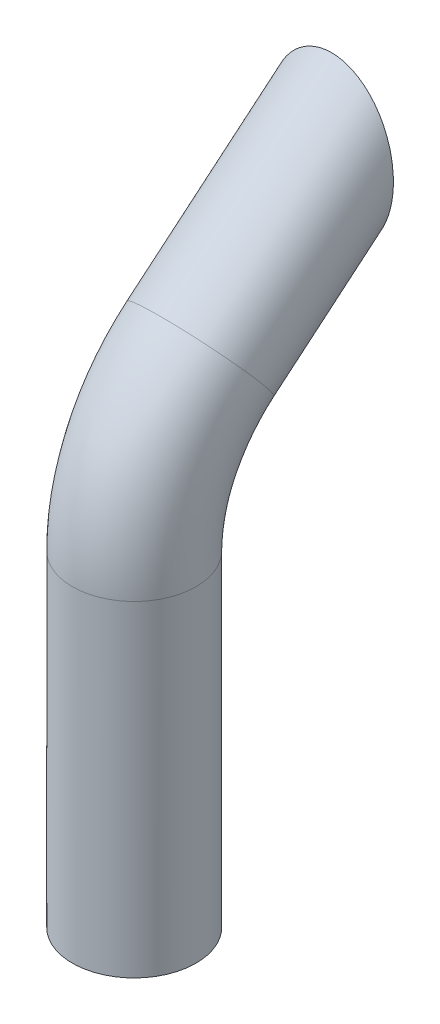
ISO-10303-21;
HEADER;
FILE_DESCRIPTION(('STEP AP214'),'2;1');
FILE_NAME('part.step','',(''),(''),'','','');
FILE_SCHEMA(('AUTOMOTIVE_DESIGN { 1 0 10303 214 1 1 1 1 }'));
ENDSEC;
DATA;
#1=APPLICATION_CONTEXT('core data for automotive mechanical design processes');
#2=APPLICATION_PROTOCOL_DEFINITION('international standard','automotive_design',2000,#1);
#3=PRODUCT_CONTEXT('',#1,'mechanical');
#4=PRODUCT('Part','Part','',(#3));
#5=PRODUCT_RELATED_PRODUCT_CATEGORY('part','',(#4));
#6=PRODUCT_DEFINITION_FORMATION('','',#4);
#7=PRODUCT_DEFINITION_CONTEXT('part definition',#1,'design');
#8=PRODUCT_DEFINITION('design','',#6,#7);
#9=PRODUCT_DEFINITION_SHAPE('','',#8);
#10=(LENGTH_UNIT() NAMED_UNIT(*) SI_UNIT(.MILLI.,.METRE.));
#11=(NAMED_UNIT(*) PLANE_ANGLE_UNIT() SI_UNIT($,.RADIAN.));
#12=(NAMED_UNIT(*) SI_UNIT($,.STERADIAN.) SOLID_ANGLE_UNIT());
#13=UNCERTAINTY_MEASURE_WITH_UNIT(LENGTH_MEASURE(1.E-05),#10,'distance_accuracy_value','');
#14=(GEOMETRIC_REPRESENTATION_CONTEXT(3) GLOBAL_UNCERTAINTY_ASSIGNED_CONTEXT((#13)) GLOBAL_UNIT_ASSIGNED_CONTEXT((#10,
#11,#12)) REPRESENTATION_CONTEXT('',''));
#15=CARTESIAN_POINT('',(0.,0.,0.));
#16=DIRECTION('',(0.,0.,1.));
#17=DIRECTION('',(1.,0.,0.));
#18=AXIS2_PLACEMENT_3D('',#15,#16,#17);
#19=CARTESIAN_POINT('',(0.,-296.418141452981,114.906666467847));
#20=DIRECTION('',(0.,-1.,0.));
#21=DIRECTION('',(0.,0.,-1.));
#22=AXIS2_PLACEMENT_3D('',#19,#20,#21);
#23=PLANE('',#22);
#24=CARTESIAN_POINT('',(0.,-296.418141452981,114.906666467847));
#25=DIRECTION('',(0.,-1.,0.));
#26=DIRECTION('',(0.,0.,-1.));
#27=AXIS2_PLACEMENT_3D('',#24,#25,#26);
#28=CIRCLE('',#27,27.);
#29=CARTESIAN_POINT('',(0.,-296.418141452981,87.9066664678468));
#30=VERTEX_POINT('',#29);
#31=EDGE_CURVE('E47',#30,#30,#28,.T.);
#32=ORIENTED_EDGE('',*,*,#31,.F.);
#33=EDGE_LOOP('',(#32));
#34=FACE_BOUND('',#33,.T.);
#35=CARTESIAN_POINT('',(0.,-296.418141452981,114.906666467847));
#36=DIRECTION('',(0.,-1.,0.));
#37=DIRECTION('',(0.,0.,-1.));
#38=AXIS2_PLACEMENT_3D('',#35,#36,#37);
#39=CIRCLE('',#38,30.);
#40=CARTESIAN_POINT('',(0.,-296.418141452981,84.9066664678468));
#41=VERTEX_POINT('',#40);
#42=EDGE_CURVE('E10',#41,#41,#39,.T.);
#43=ORIENTED_EDGE('',*,*,#42,.T.);
#44=EDGE_LOOP('',(#43));
#45=FACE_BOUND('',#44,.T.);
#46=ADVANCED_FACE('F31',(#34,#45),#23,.T.);
#47=CARTESIAN_POINT('',(0.,0.,0.));
#48=DIRECTION('',(0.,-0.642787609686538,0.766044443118979));
#49=DIRECTION('',(0.,-0.766044443118979,-0.642787609686538));
#50=AXIS2_PLACEMENT_3D('',#47,#48,#49);
#51=CYLINDRICAL_SURFACE('',#50,30.);
#52=CARTESIAN_POINT('',(0.,-16.1808853863989,19.2836282905961));
#53=DIRECTION('',(0.,0.,1.));
#54=DIRECTION('',(0.,-1.,0.));
#55=AXIS2_PLACEMENT_3D('',#52,#53,#54);
#56=ELLIPSE('',#55,39.1622186799683,30.);
#57=CARTESIAN_POINT('',(0.,-55.3431040663672,19.2836282905961));
#58=VERTEX_POINT('',#57);
#59=EDGE_CURVE('E56',#58,#58,#56,.F.);
#60=ORIENTED_EDGE('',*,*,#59,.F.);
#61=EDGE_LOOP('',(#60));
#62=FACE_BOUND('',#61,.T.);
#63=CARTESIAN_POINT('',(0.,-69.4418308062222,82.757551339635));
#64=DIRECTION('',(0.,-0.642787609686538,0.766044443118979));
#65=DIRECTION('',(0.,-0.766044443118979,-0.642787609686538));
#66=AXIS2_PLACEMENT_3D('',#63,#64,#65);
#67=CIRCLE('',#66,30.);
#68=CARTESIAN_POINT('',(0.,-46.4604975126528,102.041179630231));
#69=VERTEX_POINT('',#68);
#70=EDGE_CURVE('E42',#69,#69,#67,.T.);
#71=ORIENTED_EDGE('',*,*,#70,.F.);
#72=EDGE_LOOP('',(#71));
#73=FACE_BOUND('',#72,.T.);
#74=ADVANCED_FACE('F85',(#62,#73),#51,.T.);
#75=CARTESIAN_POINT('',(0.,-138.385830686931,24.9066664678469));
#76=DIRECTION('',(1.,0.,0.));
#77=DIRECTION('',(0.,0.,-1.));
#78=AXIS2_PLACEMENT_3D('',#75,#76,#77);
#79=TOROIDAL_SURFACE('',#78,90.,30.);
#80=CARTESIAN_POINT('',(0.,-138.385830686931,114.906666467847));
#81=DIRECTION('',(0.,-1.,0.));
#82=DIRECTION('',(0.,0.,-1.));
#83=AXIS2_PLACEMENT_3D('',#80,#81,#82);
#84=CIRCLE('',#83,30.);
#85=CARTESIAN_POINT('',(0.,-138.385830686931,144.906666467847));
#86=VERTEX_POINT('',#85);
#87=EDGE_CURVE('E38',#86,#86,#84,.T.);
#88=CARTESIAN_POINT('',(0.,-138.385830686931,24.9066664678469));
#89=DIRECTION('',(1.,0.,0.));
#90=DIRECTION('',(0.,0.,-1.));
#91=AXIS2_PLACEMENT_3D('',#88,#89,#90);
#92=CIRCLE('',#91,120.);
#93=EDGE_CURVE('',#69,#86,#92,.T.);
#94=ORIENTED_EDGE('',*,*,#70,.T.);
#95=ORIENTED_EDGE('',*,*,#87,.F.);
#96=ORIENTED_EDGE('',*,*,#93,.T.);
#97=ORIENTED_EDGE('',*,*,#93,.F.);
#98=EDGE_LOOP('',(#94,#96,#95,#97));
#99=FACE_BOUND('',#98,.T.);
#100=ADVANCED_FACE('F80',(#99),#79,.T.);
#101=CARTESIAN_POINT('',(0.,-138.385830686931,114.906666467847));
#102=DIRECTION('',(0.,-1.,0.));
#103=DIRECTION('',(0.,0.,-1.));
#104=AXIS2_PLACEMENT_3D('',#101,#102,#103);
#105=CYLINDRICAL_SURFACE('',#104,30.);
#106=ORIENTED_EDGE('',*,*,#42,.F.);
#107=EDGE_LOOP('',(#106));
#108=FACE_BOUND('',#107,.T.);
#109=ORIENTED_EDGE('',*,*,#87,.T.);
#110=EDGE_LOOP('',(#109));
#111=FACE_BOUND('',#110,.T.);
#112=ADVANCED_FACE('F78',(#108,#111),#105,.T.);
#113=CARTESIAN_POINT('',(0.,0.,0.));
#114=DIRECTION('',(0.,-0.642787609686538,0.766044443118979));
#115=DIRECTION('',(0.,-0.766044443118979,-0.642787609686538));
#116=AXIS2_PLACEMENT_3D('',#113,#114,#115);
#117=CYLINDRICAL_SURFACE('',#116,27.);
#118=CARTESIAN_POINT('',(0.,-16.1808853863989,19.2836282905961));
#119=DIRECTION('',(0.,0.,1.));
#120=DIRECTION('',(0.,-1.,0.));
#121=AXIS2_PLACEMENT_3D('',#118,#119,#120);
#122=ELLIPSE('',#121,35.2459968119715,27.);
#123=CARTESIAN_POINT('',(0.,-51.4268821983704,19.2836282905961));
#124=VERTEX_POINT('',#123);
#125=EDGE_CURVE('E34',#124,#124,#122,.F.);
#126=ORIENTED_EDGE('',*,*,#125,.T.);
#127=EDGE_LOOP('',(#126));
#128=FACE_BOUND('',#127,.T.);
#129=CARTESIAN_POINT('',(0.,-69.4418308062223,82.757551339635));
#130=DIRECTION('',(0.,0.642787609686535,-0.766044443118981));
#131=DIRECTION('',(0.,0.766044443118981,0.642787609686535));
#132=AXIS2_PLACEMENT_3D('',#129,#130,#131);
#133=CIRCLE('',#132,27.);
#134=CARTESIAN_POINT('',(0.,-48.7586308420098,100.112816801171));
#135=VERTEX_POINT('',#134);
#136=EDGE_CURVE('E53',#135,#135,#133,.F.);
#137=ORIENTED_EDGE('',*,*,#136,.T.);
#138=EDGE_LOOP('',(#137));
#139=FACE_BOUND('',#138,.T.);
#140=ADVANCED_FACE('F63',(#128,#139),#117,.F.);
#141=CARTESIAN_POINT('',(0.,-138.385830686931,24.9066664678469));
#142=DIRECTION('',(1.,0.,0.));
#143=DIRECTION('',(0.,0.,-1.));
#144=AXIS2_PLACEMENT_3D('',#141,#142,#143);
#145=TOROIDAL_SURFACE('',#144,90.,27.);
#146=CARTESIAN_POINT('',(0.,-138.385830686931,114.906666467847));
#147=DIRECTION('',(0.,-1.,0.));
#148=DIRECTION('',(0.,0.,-1.));
#149=AXIS2_PLACEMENT_3D('',#146,#147,#148);
#150=CIRCLE('',#149,27.);
#151=CARTESIAN_POINT('',(0.,-138.385830686931,141.906666467847));
#152=VERTEX_POINT('',#151);
#153=EDGE_CURVE('E50',#152,#152,#150,.T.);
#154=CARTESIAN_POINT('',(0.,-138.385830686931,24.9066664678469));
#155=DIRECTION('',(1.,0.,0.));
#156=DIRECTION('',(0.,0.,-1.));
#157=AXIS2_PLACEMENT_3D('',#154,#155,#156);
#158=CIRCLE('',#157,117.);
#159=EDGE_CURVE('',#135,#152,#158,.T.);
#160=ORIENTED_EDGE('',*,*,#136,.F.);
#161=ORIENTED_EDGE('',*,*,#153,.T.);
#162=ORIENTED_EDGE('',*,*,#159,.T.);
#163=ORIENTED_EDGE('',*,*,#159,.F.);
#164=EDGE_LOOP('',(#160,#162,#161,#163));
#165=FACE_BOUND('',#164,.T.);
#166=ADVANCED_FACE('F73',(#165),#145,.F.);
#167=CARTESIAN_POINT('',(0.,-138.385830686931,114.906666467847));
#168=DIRECTION('',(0.,-1.,0.));
#169=DIRECTION('',(0.,0.,-1.));
#170=AXIS2_PLACEMENT_3D('',#167,#168,#169);
#171=CYLINDRICAL_SURFACE('',#170,27.);
#172=ORIENTED_EDGE('',*,*,#31,.T.);
#173=EDGE_LOOP('',(#172));
#174=FACE_BOUND('',#173,.T.);
#175=ORIENTED_EDGE('',*,*,#153,.F.);
#176=EDGE_LOOP('',(#175));
#177=FACE_BOUND('',#176,.T.);
#178=ADVANCED_FACE('F68',(#174,#177),#171,.F.);
#179=CARTESIAN_POINT('',(-50.,22.9813332935694,19.2836282905961));
#180=DIRECTION('',(0.,0.,1.));
#181=DIRECTION('',(1.,0.,0.));
#182=AXIS2_PLACEMENT_3D('',#179,#180,#181);
#183=PLANE('',#182);
#184=ORIENTED_EDGE('',*,*,#59,.T.);
#185=EDGE_LOOP('',(#184));
#186=FACE_BOUND('',#185,.T.);
#187=ORIENTED_EDGE('',*,*,#125,.F.);
#188=EDGE_LOOP('',(#187));
#189=FACE_BOUND('',#188,.T.);
#190=ADVANCED_FACE('F66',(#186,#189),#183,.F.);
#191=CLOSED_SHELL('',(#46,#74,#100,#112,#140,#166,#178,#190));
#192=MANIFOLD_SOLID_BREP('B2',#191);
#193=ADVANCED_BREP_SHAPE_REPRESENTATION('',(#18,#192),#14);
#194=SHAPE_DEFINITION_REPRESENTATION(#9,#193);
ENDSEC;
END-ISO-10303-21;
